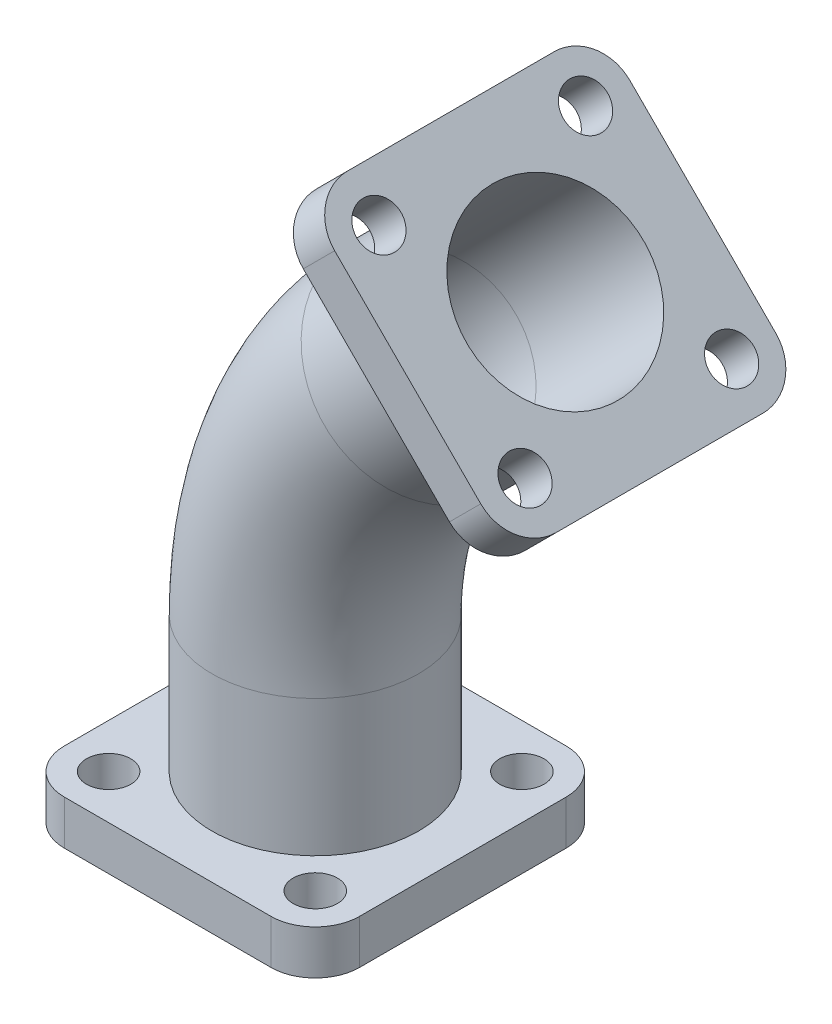
ISO-10303-21;
HEADER;
FILE_DESCRIPTION(('STEP AP214'),'2;1');
FILE_NAME('part.step','',(''),(''),'','','');
FILE_SCHEMA(('AUTOMOTIVE_DESIGN { 1 0 10303 214 1 1 1 1 }'));
ENDSEC;
DATA;
#1=APPLICATION_CONTEXT('core data for automotive mechanical design processes');
#2=APPLICATION_PROTOCOL_DEFINITION('international standard','automotive_design',2000,#1);
#3=PRODUCT_CONTEXT('',#1,'mechanical');
#4=PRODUCT('Part','Part','',(#3));
#5=PRODUCT_RELATED_PRODUCT_CATEGORY('part','',(#4));
#6=PRODUCT_DEFINITION_FORMATION('','',#4);
#7=PRODUCT_DEFINITION_CONTEXT('part definition',#1,'design');
#8=PRODUCT_DEFINITION('design','',#6,#7);
#9=PRODUCT_DEFINITION_SHAPE('','',#8);
#10=(LENGTH_UNIT() NAMED_UNIT(*) SI_UNIT(.MILLI.,.METRE.));
#11=(NAMED_UNIT(*) PLANE_ANGLE_UNIT() SI_UNIT($,.RADIAN.));
#12=(NAMED_UNIT(*) SI_UNIT($,.STERADIAN.) SOLID_ANGLE_UNIT());
#13=UNCERTAINTY_MEASURE_WITH_UNIT(LENGTH_MEASURE(1.E-05),#10,'distance_accuracy_value','');
#14=(GEOMETRIC_REPRESENTATION_CONTEXT(3) GLOBAL_UNCERTAINTY_ASSIGNED_CONTEXT((#13)) GLOBAL_UNIT_ASSIGNED_CONTEXT((#10,
#11,#12)) REPRESENTATION_CONTEXT('',''));
#15=CARTESIAN_POINT('',(0.,0.,0.));
#16=DIRECTION('',(0.,0.,1.));
#17=DIRECTION('',(1.,0.,0.));
#18=AXIS2_PLACEMENT_3D('',#15,#16,#17);
#19=CARTESIAN_POINT('',(138.817279836453,138.817279836453,0.));
#20=DIRECTION('',(-0.707106781186548,-0.707106781186547,0.));
#21=DIRECTION('',(0.707106781186547,-0.707106781186548,0.));
#22=AXIS2_PLACEMENT_3D('',#19,#20,#21);
#23=PLANE('',#22);
#24=CARTESIAN_POINT('',(106.066017177982,171.568542494924,35.));
#25=DIRECTION('',(0.707106781186548,0.707106781186547,0.));
#26=DIRECTION('',(-0.707106781186547,0.707106781186548,0.));
#27=AXIS2_PLACEMENT_3D('',#24,#25,#26);
#28=CIRCLE('',#27,7.50000000000001);
#29=CARTESIAN_POINT('',(100.762716319083,176.871843353823,35.));
#30=VERTEX_POINT('',#29);
#31=EDGE_CURVE('E766',#30,#30,#28,.T.);
#32=ORIENTED_EDGE('',*,*,#31,.F.);
#33=EDGE_LOOP('',(#32));
#34=FACE_BOUND('',#33,.T.);
#35=CARTESIAN_POINT('',(106.066017177982,171.568542494924,-35.));
#36=DIRECTION('',(0.707106781186548,0.707106781186547,0.));
#37=DIRECTION('',(-0.707106781186547,0.707106781186548,0.));
#38=AXIS2_PLACEMENT_3D('',#35,#36,#37);
#39=CIRCLE('',#38,7.50000000000001);
#40=CARTESIAN_POINT('',(100.762716319083,176.871843353823,-35.));
#41=VERTEX_POINT('',#40);
#42=EDGE_CURVE('E775',#41,#41,#39,.T.);
#43=ORIENTED_EDGE('',*,*,#42,.F.);
#44=EDGE_LOOP('',(#43));
#45=FACE_BOUND('',#44,.T.);
#46=CARTESIAN_POINT('',(81.3172798364531,196.317279836453,0.));
#47=DIRECTION('',(0.707106781186548,0.707106781186547,0.));
#48=DIRECTION('',(-0.707106781186547,0.707106781186548,0.));
#49=AXIS2_PLACEMENT_3D('',#46,#47,#48);
#50=CIRCLE('',#49,30.);
#51=CARTESIAN_POINT('',(60.1040764008567,217.530483272049,0.));
#52=VERTEX_POINT('',#51);
#53=EDGE_CURVE('E787',#52,#52,#50,.T.);
#54=ORIENTED_EDGE('',*,*,#53,.F.);
#55=EDGE_LOOP('',(#54));
#56=FACE_BOUND('',#55,.T.);
#57=DIRECTION('',(0.,0.,1.));
#58=VECTOR('',#57,1.);
#59=CARTESIAN_POINT('',(45.9619407771257,231.67261889578,50.));
#60=LINE('',#59,#58);
#61=CARTESIAN_POINT('',(45.9619407771257,231.67261889578,-35.));
#62=VERTEX_POINT('',#61);
#63=CARTESIAN_POINT('',(45.9619407771257,231.67261889578,35.));
#64=VERTEX_POINT('',#63);
#65=EDGE_CURVE('E287',#62,#64,#60,.T.);
#66=ORIENTED_EDGE('',*,*,#65,.T.);
#67=CARTESIAN_POINT('',(56.5685424949239,221.066017177982,35.));
#68=DIRECTION('',(-0.707106781186548,-0.707106781186547,0.));
#69=DIRECTION('',(0.707106781186547,-0.707106781186548,0.));
#70=AXIS2_PLACEMENT_3D('',#67,#68,#69);
#71=CIRCLE('',#70,15.);
#72=CARTESIAN_POINT('',(56.5685424949239,221.066017177982,50.));
#73=VERTEX_POINT('',#72);
#74=EDGE_CURVE('E254',#64,#73,#71,.F.);
#75=ORIENTED_EDGE('',*,*,#74,.T.);
#76=DIRECTION('',(0.707106781186547,-0.707106781186548,0.));
#77=VECTOR('',#76,1.);
#78=CARTESIAN_POINT('',(116.67261889578,160.961940777126,50.));
#79=LINE('',#78,#77);
#80=CARTESIAN_POINT('',(106.066017177982,171.568542494924,50.));
#81=VERTEX_POINT('',#80);
#82=EDGE_CURVE('E277',#73,#81,#79,.T.);
#83=ORIENTED_EDGE('',*,*,#82,.T.);
#84=CARTESIAN_POINT('',(106.066017177982,171.568542494924,35.));
#85=DIRECTION('',(-0.707106781186548,-0.707106781186547,0.));
#86=DIRECTION('',(0.707106781186547,-0.707106781186548,0.));
#87=AXIS2_PLACEMENT_3D('',#84,#85,#86);
#88=CIRCLE('',#87,15.);
#89=CARTESIAN_POINT('',(116.67261889578,160.961940777126,35.));
#90=VERTEX_POINT('',#89);
#91=EDGE_CURVE('E252',#81,#90,#88,.F.);
#92=ORIENTED_EDGE('',*,*,#91,.T.);
#93=DIRECTION('',(0.,0.,-1.));
#94=VECTOR('',#93,1.);
#95=CARTESIAN_POINT('',(116.67261889578,160.961940777126,50.));
#96=LINE('',#95,#94);
#97=CARTESIAN_POINT('',(116.67261889578,160.961940777126,-35.));
#98=VERTEX_POINT('',#97);
#99=EDGE_CURVE('E792',#90,#98,#96,.T.);
#100=ORIENTED_EDGE('',*,*,#99,.T.);
#101=CARTESIAN_POINT('',(106.066017177982,171.568542494924,-35.));
#102=DIRECTION('',(-0.707106781186548,-0.707106781186547,0.));
#103=DIRECTION('',(0.707106781186547,-0.707106781186548,0.));
#104=AXIS2_PLACEMENT_3D('',#101,#102,#103);
#105=CIRCLE('',#104,15.);
#106=CARTESIAN_POINT('',(106.066017177982,171.568542494924,-50.));
#107=VERTEX_POINT('',#106);
#108=EDGE_CURVE('E81',#98,#107,#105,.F.);
#109=ORIENTED_EDGE('',*,*,#108,.T.);
#110=DIRECTION('',(-0.707106781186547,0.707106781186548,0.));
#111=VECTOR('',#110,1.);
#112=CARTESIAN_POINT('',(116.67261889578,160.961940777126,-50.));
#113=LINE('',#112,#111);
#114=CARTESIAN_POINT('',(56.5685424949239,221.066017177982,-50.));
#115=VERTEX_POINT('',#114);
#116=EDGE_CURVE('E265',#107,#115,#113,.T.);
#117=ORIENTED_EDGE('',*,*,#116,.T.);
#118=CARTESIAN_POINT('',(56.5685424949239,221.066017177982,-35.));
#119=DIRECTION('',(-0.707106781186548,-0.707106781186547,0.));
#120=DIRECTION('',(0.707106781186547,-0.707106781186548,0.));
#121=AXIS2_PLACEMENT_3D('',#118,#119,#120);
#122=CIRCLE('',#121,15.);
#123=EDGE_CURVE('E250',#115,#62,#122,.F.);
#124=ORIENTED_EDGE('',*,*,#123,.T.);
#125=EDGE_LOOP('',(#66,#75,#83,#92,#100,#109,#117,#124));
#126=FACE_BOUND('',#125,.T.);
#127=CARTESIAN_POINT('',(56.5685424949239,221.066017177982,-35.));
#128=DIRECTION('',(0.707106781186548,0.707106781186547,0.));
#129=DIRECTION('',(-0.707106781186547,0.707106781186548,0.));
#130=AXIS2_PLACEMENT_3D('',#127,#128,#129);
#131=CIRCLE('',#130,7.50000000000001);
#132=CARTESIAN_POINT('',(51.2652416360248,226.369318036881,-35.));
#133=VERTEX_POINT('',#132);
#134=EDGE_CURVE('E781',#133,#133,#131,.T.);
#135=ORIENTED_EDGE('',*,*,#134,.F.);
#136=EDGE_LOOP('',(#135));
#137=FACE_BOUND('',#136,.T.);
#138=CARTESIAN_POINT('',(56.5685424949239,221.066017177982,35.));
#139=DIRECTION('',(0.707106781186548,0.707106781186547,0.));
#140=DIRECTION('',(-0.707106781186547,0.707106781186548,0.));
#141=AXIS2_PLACEMENT_3D('',#138,#139,#140);
#142=CIRCLE('',#141,7.50000000000001);
#143=CARTESIAN_POINT('',(51.2652416360248,226.369318036881,35.));
#144=VERTEX_POINT('',#143);
#145=EDGE_CURVE('E762',#144,#144,#142,.T.);
#146=ORIENTED_EDGE('',*,*,#145,.F.);
#147=EDGE_LOOP('',(#146));
#148=FACE_BOUND('',#147,.T.);
#149=ADVANCED_FACE('F61',(#34,#45,#56,#126,#137,#148),#23,.F.);
#150=CARTESIAN_POINT('',(-50.,0.,50.));
#151=DIRECTION('',(1.,0.,0.));
#152=DIRECTION('',(0.,0.,-1.));
#153=AXIS2_PLACEMENT_3D('',#150,#151,#152);
#154=PLANE('',#153);
#155=DIRECTION('',(0.,0.,-1.));
#156=VECTOR('',#155,1.);
#157=CARTESIAN_POINT('',(-50.,15.,50.));
#158=LINE('',#157,#156);
#159=CARTESIAN_POINT('',(-50.,15.,35.));
#160=VERTEX_POINT('',#159);
#161=CARTESIAN_POINT('',(-50.,15.,-35.));
#162=VERTEX_POINT('',#161);
#163=EDGE_CURVE('E332',#160,#162,#158,.T.);
#164=ORIENTED_EDGE('',*,*,#163,.T.);
#165=DIRECTION('',(0.,-1.,0.));
#166=VECTOR('',#165,1.);
#167=CARTESIAN_POINT('',(-50.,0.,-35.));
#168=LINE('',#167,#166);
#169=CARTESIAN_POINT('',(-50.,0.,-35.));
#170=VERTEX_POINT('',#169);
#171=EDGE_CURVE('E194',#162,#170,#168,.T.);
#172=ORIENTED_EDGE('',*,*,#171,.T.);
#173=DIRECTION('',(0.,0.,-1.));
#174=VECTOR('',#173,1.);
#175=CARTESIAN_POINT('',(-50.,0.,50.));
#176=LINE('',#175,#174);
#177=CARTESIAN_POINT('',(-50.,0.,35.));
#178=VERTEX_POINT('',#177);
#179=EDGE_CURVE('E177',#178,#170,#176,.T.);
#180=ORIENTED_EDGE('',*,*,#179,.F.);
#181=DIRECTION('',(0.,-1.,0.));
#182=VECTOR('',#181,1.);
#183=CARTESIAN_POINT('',(-50.,0.,35.));
#184=LINE('',#183,#182);
#185=EDGE_CURVE('E191',#178,#160,#184,.F.);
#186=ORIENTED_EDGE('',*,*,#185,.T.);
#187=EDGE_LOOP('',(#164,#172,#180,#186));
#188=FACE_BOUND('',#187,.T.);
#189=ADVANCED_FACE('F190',(#188),#154,.F.);
#190=CARTESIAN_POINT('',(-50.,0.,50.));
#191=DIRECTION('',(0.,1.,0.));
#192=DIRECTION('',(-1.,0.,0.));
#193=AXIS2_PLACEMENT_3D('',#190,#191,#192);
#194=PLANE('',#193);
#195=CARTESIAN_POINT('',(-35.,0.,-35.));
#196=DIRECTION('',(0.,1.,0.));
#197=DIRECTION('',(0.,0.,1.));
#198=AXIS2_PLACEMENT_3D('',#195,#196,#197);
#199=CIRCLE('',#198,7.50000000000001);
#200=CARTESIAN_POINT('',(-35.,0.,-27.5));
#201=VERTEX_POINT('',#200);
#202=EDGE_CURVE('E290',#201,#201,#199,.T.);
#203=ORIENTED_EDGE('',*,*,#202,.T.);
#204=EDGE_LOOP('',(#203));
#205=FACE_BOUND('',#204,.T.);
#206=CARTESIAN_POINT('',(-35.,0.,35.));
#207=DIRECTION('',(0.,1.,0.));
#208=DIRECTION('',(0.,0.,1.));
#209=AXIS2_PLACEMENT_3D('',#206,#207,#208);
#210=CIRCLE('',#209,7.50000000000001);
#211=CARTESIAN_POINT('',(-35.,0.,42.5));
#212=VERTEX_POINT('',#211);
#213=EDGE_CURVE('E296',#212,#212,#210,.T.);
#214=ORIENTED_EDGE('',*,*,#213,.T.);
#215=EDGE_LOOP('',(#214));
#216=FACE_BOUND('',#215,.T.);
#217=CARTESIAN_POINT('',(35.,0.,-35.));
#218=DIRECTION('',(0.,1.,0.));
#219=DIRECTION('',(0.,0.,1.));
#220=AXIS2_PLACEMENT_3D('',#217,#218,#219);
#221=CIRCLE('',#220,7.50000000000001);
#222=CARTESIAN_POINT('',(35.,0.,-27.5));
#223=VERTEX_POINT('',#222);
#224=EDGE_CURVE('E302',#223,#223,#221,.T.);
#225=ORIENTED_EDGE('',*,*,#224,.T.);
#226=EDGE_LOOP('',(#225));
#227=FACE_BOUND('',#226,.T.);
#228=CARTESIAN_POINT('',(35.,0.,35.));
#229=DIRECTION('',(0.,1.,0.));
#230=DIRECTION('',(0.,0.,1.));
#231=AXIS2_PLACEMENT_3D('',#228,#229,#230);
#232=CIRCLE('',#231,7.50000000000001);
#233=CARTESIAN_POINT('',(35.,0.,42.5));
#234=VERTEX_POINT('',#233);
#235=EDGE_CURVE('E308',#234,#234,#232,.T.);
#236=ORIENTED_EDGE('',*,*,#235,.T.);
#237=EDGE_LOOP('',(#236));
#238=FACE_BOUND('',#237,.T.);
#239=CARTESIAN_POINT('',(0.,0.,0.));
#240=DIRECTION('',(0.,1.,0.));
#241=DIRECTION('',(-1.,0.,0.));
#242=AXIS2_PLACEMENT_3D('',#239,#240,#241);
#243=CIRCLE('',#242,30.);
#244=CARTESIAN_POINT('',(-30.,0.,0.));
#245=VERTEX_POINT('',#244);
#246=EDGE_CURVE('E317',#245,#245,#243,.T.);
#247=ORIENTED_EDGE('',*,*,#246,.T.);
#248=EDGE_LOOP('',(#247));
#249=FACE_BOUND('',#248,.T.);
#250=ORIENTED_EDGE('',*,*,#179,.T.);
#251=CARTESIAN_POINT('',(-35.,0.,-35.));
#252=DIRECTION('',(0.,1.,0.));
#253=DIRECTION('',(-1.,0.,0.));
#254=AXIS2_PLACEMENT_3D('',#251,#252,#253);
#255=CIRCLE('',#254,15.);
#256=CARTESIAN_POINT('',(-35.,0.,-50.));
#257=VERTEX_POINT('',#256);
#258=EDGE_CURVE('E208',#170,#257,#255,.F.);
#259=ORIENTED_EDGE('',*,*,#258,.T.);
#260=DIRECTION('',(1.,0.,0.));
#261=VECTOR('',#260,1.);
#262=CARTESIAN_POINT('',(-50.,0.,-50.));
#263=LINE('',#262,#261);
#264=CARTESIAN_POINT('',(35.,0.,-50.));
#265=VERTEX_POINT('',#264);
#266=EDGE_CURVE('E326',#257,#265,#263,.T.);
#267=ORIENTED_EDGE('',*,*,#266,.T.);
#268=CARTESIAN_POINT('',(35.,0.,-35.));
#269=DIRECTION('',(0.,1.,0.));
#270=DIRECTION('',(-1.,0.,0.));
#271=AXIS2_PLACEMENT_3D('',#268,#269,#270);
#272=CIRCLE('',#271,15.);
#273=CARTESIAN_POINT('',(50.,0.,-35.));
#274=VERTEX_POINT('',#273);
#275=EDGE_CURVE('E184',#265,#274,#272,.F.);
#276=ORIENTED_EDGE('',*,*,#275,.T.);
#277=DIRECTION('',(0.,0.,-1.));
#278=VECTOR('',#277,1.);
#279=CARTESIAN_POINT('',(50.,0.,50.));
#280=LINE('',#279,#278);
#281=CARTESIAN_POINT('',(50.,0.,35.));
#282=VERTEX_POINT('',#281);
#283=EDGE_CURVE('E196',#282,#274,#280,.T.);
#284=ORIENTED_EDGE('',*,*,#283,.F.);
#285=CARTESIAN_POINT('',(35.,0.,35.));
#286=DIRECTION('',(0.,1.,0.));
#287=DIRECTION('',(-1.,0.,0.));
#288=AXIS2_PLACEMENT_3D('',#285,#286,#287);
#289=CIRCLE('',#288,15.);
#290=CARTESIAN_POINT('',(35.,0.,50.));
#291=VERTEX_POINT('',#290);
#292=EDGE_CURVE('E185',#282,#291,#289,.F.);
#293=ORIENTED_EDGE('',*,*,#292,.T.);
#294=DIRECTION('',(1.,0.,0.));
#295=VECTOR('',#294,1.);
#296=CARTESIAN_POINT('',(-50.,0.,50.));
#297=LINE('',#296,#295);
#298=CARTESIAN_POINT('',(-35.,0.,50.));
#299=VERTEX_POINT('',#298);
#300=EDGE_CURVE('E179',#299,#291,#297,.T.);
#301=ORIENTED_EDGE('',*,*,#300,.F.);
#302=CARTESIAN_POINT('',(-35.,0.,35.));
#303=DIRECTION('',(0.,1.,0.));
#304=DIRECTION('',(-1.,0.,0.));
#305=AXIS2_PLACEMENT_3D('',#302,#303,#304);
#306=CIRCLE('',#305,15.);
#307=EDGE_CURVE('E174',#299,#178,#306,.F.);
#308=ORIENTED_EDGE('',*,*,#307,.T.);
#309=EDGE_LOOP('',(#250,#259,#267,#276,#284,#293,#301,#308));
#310=FACE_BOUND('',#309,.T.);
#311=ADVANCED_FACE('F176',(#205,#216,#227,#238,#249,#310),#194,.F.);
#312=CARTESIAN_POINT('',(50.,0.,50.));
#313=DIRECTION('',(-1.,0.,0.));
#314=DIRECTION('',(0.,0.,1.));
#315=AXIS2_PLACEMENT_3D('',#312,#313,#314);
#316=PLANE('',#315);
#317=ORIENTED_EDGE('',*,*,#283,.T.);
#318=DIRECTION('',(0.,1.,0.));
#319=VECTOR('',#318,1.);
#320=CARTESIAN_POINT('',(50.,15.,-35.));
#321=LINE('',#320,#319);
#322=CARTESIAN_POINT('',(50.,15.,-35.));
#323=VERTEX_POINT('',#322);
#324=EDGE_CURVE('E223',#274,#323,#321,.T.);
#325=ORIENTED_EDGE('',*,*,#324,.T.);
#326=DIRECTION('',(0.,0.,-1.));
#327=VECTOR('',#326,1.);
#328=CARTESIAN_POINT('',(50.,15.,50.));
#329=LINE('',#328,#327);
#330=CARTESIAN_POINT('',(50.,15.,35.));
#331=VERTEX_POINT('',#330);
#332=EDGE_CURVE('E338',#331,#323,#329,.T.);
#333=ORIENTED_EDGE('',*,*,#332,.F.);
#334=DIRECTION('',(0.,1.,0.));
#335=VECTOR('',#334,1.);
#336=CARTESIAN_POINT('',(50.,0.,35.));
#337=LINE('',#336,#335);
#338=EDGE_CURVE('E221',#331,#282,#337,.F.);
#339=ORIENTED_EDGE('',*,*,#338,.T.);
#340=EDGE_LOOP('',(#317,#325,#333,#339));
#341=FACE_BOUND('',#340,.T.);
#342=ADVANCED_FACE('F345',(#341),#316,.F.);
#343=CARTESIAN_POINT('',(-50.,15.,50.));
#344=DIRECTION('',(0.,-1.,0.));
#345=DIRECTION('',(1.,0.,0.));
#346=AXIS2_PLACEMENT_3D('',#343,#344,#345);
#347=PLANE('',#346);
#348=CARTESIAN_POINT('',(-35.,15.,-35.));
#349=DIRECTION('',(0.,1.,0.));
#350=DIRECTION('',(0.,0.,1.));
#351=AXIS2_PLACEMENT_3D('',#348,#349,#350);
#352=CIRCLE('',#351,7.50000000000001);
#353=CARTESIAN_POINT('',(-35.,15.,-27.5));
#354=VERTEX_POINT('',#353);
#355=EDGE_CURVE('E286',#354,#354,#352,.T.);
#356=ORIENTED_EDGE('',*,*,#355,.F.);
#357=EDGE_LOOP('',(#356));
#358=FACE_BOUND('',#357,.T.);
#359=CARTESIAN_POINT('',(-35.,15.,35.));
#360=DIRECTION('',(0.,1.,0.));
#361=DIRECTION('',(0.,0.,1.));
#362=AXIS2_PLACEMENT_3D('',#359,#360,#361);
#363=CIRCLE('',#362,7.50000000000001);
#364=CARTESIAN_POINT('',(-35.,15.,42.5));
#365=VERTEX_POINT('',#364);
#366=EDGE_CURVE('E293',#365,#365,#363,.T.);
#367=ORIENTED_EDGE('',*,*,#366,.F.);
#368=EDGE_LOOP('',(#367));
#369=FACE_BOUND('',#368,.T.);
#370=CARTESIAN_POINT('',(35.,15.,-35.));
#371=DIRECTION('',(0.,1.,0.));
#372=DIRECTION('',(0.,0.,1.));
#373=AXIS2_PLACEMENT_3D('',#370,#371,#372);
#374=CIRCLE('',#373,7.50000000000001);
#375=CARTESIAN_POINT('',(35.,15.,-27.5));
#376=VERTEX_POINT('',#375);
#377=EDGE_CURVE('E299',#376,#376,#374,.T.);
#378=ORIENTED_EDGE('',*,*,#377,.F.);
#379=EDGE_LOOP('',(#378));
#380=FACE_BOUND('',#379,.T.);
#381=CARTESIAN_POINT('',(35.,15.,35.));
#382=DIRECTION('',(0.,1.,0.));
#383=DIRECTION('',(0.,0.,1.));
#384=AXIS2_PLACEMENT_3D('',#381,#382,#383);
#385=CIRCLE('',#384,7.50000000000001);
#386=CARTESIAN_POINT('',(35.,15.,42.5));
#387=VERTEX_POINT('',#386);
#388=EDGE_CURVE('E305',#387,#387,#385,.T.);
#389=ORIENTED_EDGE('',*,*,#388,.F.);
#390=EDGE_LOOP('',(#389));
#391=FACE_BOUND('',#390,.T.);
#392=CARTESIAN_POINT('',(0.,15.,0.));
#393=DIRECTION('',(0.,-1.,0.));
#394=DIRECTION('',(1.,0.,0.));
#395=AXIS2_PLACEMENT_3D('',#392,#393,#394);
#396=CIRCLE('',#395,35.);
#397=CARTESIAN_POINT('',(35.,15.,0.));
#398=VERTEX_POINT('',#397);
#399=EDGE_CURVE('E195',#398,#398,#396,.F.);
#400=ORIENTED_EDGE('',*,*,#399,.F.);
#401=EDGE_LOOP('',(#400));
#402=FACE_BOUND('',#401,.T.);
#403=DIRECTION('',(-1.,0.,0.));
#404=VECTOR('',#403,1.);
#405=CARTESIAN_POINT('',(-50.,15.,-50.));
#406=LINE('',#405,#404);
#407=CARTESIAN_POINT('',(35.,15.,-50.));
#408=VERTEX_POINT('',#407);
#409=CARTESIAN_POINT('',(-35.,15.,-50.));
#410=VERTEX_POINT('',#409);
#411=EDGE_CURVE('E329',#408,#410,#406,.T.);
#412=ORIENTED_EDGE('',*,*,#411,.T.);
#413=CARTESIAN_POINT('',(-35.,15.,-35.));
#414=DIRECTION('',(0.,-1.,0.));
#415=DIRECTION('',(1.,0.,0.));
#416=AXIS2_PLACEMENT_3D('',#413,#414,#415);
#417=CIRCLE('',#416,15.);
#418=EDGE_CURVE('E219',#410,#162,#417,.F.);
#419=ORIENTED_EDGE('',*,*,#418,.T.);
#420=ORIENTED_EDGE('',*,*,#163,.F.);
#421=CARTESIAN_POINT('',(-35.,15.,35.));
#422=DIRECTION('',(0.,-1.,0.));
#423=DIRECTION('',(1.,0.,0.));
#424=AXIS2_PLACEMENT_3D('',#421,#422,#423);
#425=CIRCLE('',#424,15.);
#426=CARTESIAN_POINT('',(-35.,15.,50.));
#427=VERTEX_POINT('',#426);
#428=EDGE_CURVE('E200',#160,#427,#425,.F.);
#429=ORIENTED_EDGE('',*,*,#428,.T.);
#430=DIRECTION('',(-1.,0.,0.));
#431=VECTOR('',#430,1.);
#432=CARTESIAN_POINT('',(-50.,15.,50.));
#433=LINE('',#432,#431);
#434=CARTESIAN_POINT('',(35.,15.,50.));
#435=VERTEX_POINT('',#434);
#436=EDGE_CURVE('E328',#435,#427,#433,.T.);
#437=ORIENTED_EDGE('',*,*,#436,.F.);
#438=CARTESIAN_POINT('',(35.,15.,35.));
#439=DIRECTION('',(0.,-1.,0.));
#440=DIRECTION('',(1.,0.,0.));
#441=AXIS2_PLACEMENT_3D('',#438,#439,#440);
#442=CIRCLE('',#441,15.);
#443=EDGE_CURVE('E214',#435,#331,#442,.F.);
#444=ORIENTED_EDGE('',*,*,#443,.T.);
#445=ORIENTED_EDGE('',*,*,#332,.T.);
#446=CARTESIAN_POINT('',(35.,15.,-35.));
#447=DIRECTION('',(0.,-1.,0.));
#448=DIRECTION('',(1.,0.,0.));
#449=AXIS2_PLACEMENT_3D('',#446,#447,#448);
#450=CIRCLE('',#449,15.);
#451=EDGE_CURVE('E217',#323,#408,#450,.F.);
#452=ORIENTED_EDGE('',*,*,#451,.T.);
#453=EDGE_LOOP('',(#412,#419,#420,#429,#437,#444,#445,#452));
#454=FACE_BOUND('',#453,.T.);
#455=ADVANCED_FACE('F355',(#358,#369,#380,#391,#402,#454),#347,.F.);
#456=CARTESIAN_POINT('',(0.,0.,50.));
#457=DIRECTION('',(0.,0.,-1.));
#458=DIRECTION('',(-1.,0.,0.));
#459=AXIS2_PLACEMENT_3D('',#456,#457,#458);
#460=PLANE('',#459);
#461=ORIENTED_EDGE('',*,*,#436,.T.);
#462=DIRECTION('',(0.,-1.,0.));
#463=VECTOR('',#462,1.);
#464=CARTESIAN_POINT('',(-35.,0.,50.));
#465=LINE('',#464,#463);
#466=EDGE_CURVE('E229',#427,#299,#465,.T.);
#467=ORIENTED_EDGE('',*,*,#466,.T.);
#468=ORIENTED_EDGE('',*,*,#300,.T.);
#469=DIRECTION('',(0.,1.,0.));
#470=VECTOR('',#469,1.);
#471=CARTESIAN_POINT('',(35.,0.,50.));
#472=LINE('',#471,#470);
#473=EDGE_CURVE('E226',#291,#435,#472,.T.);
#474=ORIENTED_EDGE('',*,*,#473,.T.);
#475=EDGE_LOOP('',(#461,#467,#468,#474));
#476=FACE_BOUND('',#475,.T.);
#477=ADVANCED_FACE('F365',(#476),#460,.F.);
#478=CARTESIAN_POINT('',(0.,0.,-50.));
#479=DIRECTION('',(0.,0.,-1.));
#480=DIRECTION('',(-1.,0.,0.));
#481=AXIS2_PLACEMENT_3D('',#478,#479,#480);
#482=PLANE('',#481);
#483=ORIENTED_EDGE('',*,*,#266,.F.);
#484=DIRECTION('',(0.,-1.,0.));
#485=VECTOR('',#484,1.);
#486=CARTESIAN_POINT('',(-35.,15.,-50.));
#487=LINE('',#486,#485);
#488=EDGE_CURVE('E212',#257,#410,#487,.F.);
#489=ORIENTED_EDGE('',*,*,#488,.T.);
#490=ORIENTED_EDGE('',*,*,#411,.F.);
#491=DIRECTION('',(0.,1.,0.));
#492=VECTOR('',#491,1.);
#493=CARTESIAN_POINT('',(35.,0.,-50.));
#494=LINE('',#493,#492);
#495=EDGE_CURVE('E210',#408,#265,#494,.F.);
#496=ORIENTED_EDGE('',*,*,#495,.T.);
#497=EDGE_LOOP('',(#483,#489,#490,#496));
#498=FACE_BOUND('',#497,.T.);
#499=ADVANCED_FACE('F359',(#498),#482,.T.);
#500=CARTESIAN_POINT('',(0.,0.,0.));
#501=DIRECTION('',(0.,1.,0.));
#502=DIRECTION('',(-1.,0.,0.));
#503=AXIS2_PLACEMENT_3D('',#500,#501,#502);
#504=CYLINDRICAL_SURFACE('',#503,35.);
#505=CARTESIAN_POINT('',(0.,61.1522368914975,0.));
#506=DIRECTION('',(0.,-1.,0.));
#507=DIRECTION('',(1.,0.,0.));
#508=AXIS2_PLACEMENT_3D('',#505,#506,#507);
#509=CIRCLE('',#508,35.);
#510=CARTESIAN_POINT('',(-35.,61.1522368914975,0.));
#511=VERTEX_POINT('',#510);
#512=EDGE_CURVE('E320',#511,#511,#509,.T.);
#513=ORIENTED_EDGE('',*,*,#512,.T.);
#514=EDGE_LOOP('',(#513));
#515=FACE_BOUND('',#514,.T.);
#516=ORIENTED_EDGE('',*,*,#399,.T.);
#517=EDGE_LOOP('',(#516));
#518=FACE_BOUND('',#517,.T.);
#519=ADVANCED_FACE('F437',(#515,#518),#504,.T.);
#520=CARTESIAN_POINT('',(130.,61.1522368914975,0.));
#521=DIRECTION('',(0.,0.,-1.));
#522=DIRECTION('',(-1.,0.,0.));
#523=AXIS2_PLACEMENT_3D('',#520,#521,#522);
#524=TOROIDAL_SURFACE('',#523,130.,35.);
#525=CARTESIAN_POINT('',(38.076118445749,153.076118445749,0.));
#526=DIRECTION('',(-0.707106781186548,-0.707106781186547,0.));
#527=DIRECTION('',(0.707106781186547,-0.707106781186548,0.));
#528=AXIS2_PLACEMENT_3D('',#525,#526,#527);
#529=CIRCLE('',#528,35.);
#530=CARTESIAN_POINT('',(13.3273811042199,177.824855787278,0.));
#531=VERTEX_POINT('',#530);
#532=EDGE_CURVE('E323',#531,#531,#529,.T.);
#533=CARTESIAN_POINT('',(130.,61.1522368914975,0.));
#534=DIRECTION('',(0.,0.,-1.));
#535=DIRECTION('',(-1.,0.,0.));
#536=AXIS2_PLACEMENT_3D('',#533,#534,#535);
#537=CIRCLE('',#536,165.);
#538=EDGE_CURVE('',#511,#531,#537,.T.);
#539=ORIENTED_EDGE('',*,*,#512,.F.);
#540=ORIENTED_EDGE('',*,*,#532,.T.);
#541=ORIENTED_EDGE('',*,*,#538,.T.);
#542=ORIENTED_EDGE('',*,*,#538,.F.);
#543=EDGE_LOOP('',(#539,#541,#540,#542));
#544=FACE_BOUND('',#543,.T.);
#545=ADVANCED_FACE('F436',(#544),#524,.T.);
#546=CARTESIAN_POINT('',(38.076118445749,153.076118445749,0.));
#547=DIRECTION('',(0.707106781186549,0.707106781186546,0.));
#548=DIRECTION('',(-0.707106781186546,0.707106781186549,0.));
#549=AXIS2_PLACEMENT_3D('',#546,#547,#548);
#550=CYLINDRICAL_SURFACE('',#549,35.);
#551=CARTESIAN_POINT('',(70.7106781186549,185.710678118655,0.));
#552=DIRECTION('',(-0.707106781186548,-0.707106781186547,0.));
#553=DIRECTION('',(0.707106781186547,-0.707106781186548,0.));
#554=AXIS2_PLACEMENT_3D('',#551,#552,#553);
#555=CIRCLE('',#554,35.);
#556=CARTESIAN_POINT('',(95.4594154601841,160.961940777126,0.));
#557=VERTEX_POINT('',#556);
#558=EDGE_CURVE('E283',#557,#557,#555,.T.);
#559=ORIENTED_EDGE('',*,*,#558,.T.);
#560=EDGE_LOOP('',(#559));
#561=FACE_BOUND('',#560,.T.);
#562=ORIENTED_EDGE('',*,*,#532,.F.);
#563=EDGE_LOOP('',(#562));
#564=FACE_BOUND('',#563,.T.);
#565=ADVANCED_FACE('F427',(#561,#564),#550,.T.);
#566=CARTESIAN_POINT('',(0.,-4.99999999999992,0.));
#567=DIRECTION('',(0.,1.,0.));
#568=DIRECTION('',(-1.,0.,0.));
#569=AXIS2_PLACEMENT_3D('',#566,#567,#568);
#570=CYLINDRICAL_SURFACE('',#569,30.);
#571=ORIENTED_EDGE('',*,*,#246,.F.);
#572=EDGE_LOOP('',(#571));
#573=FACE_BOUND('',#572,.T.);
#574=CARTESIAN_POINT('',(0.,61.1522368914975,0.));
#575=DIRECTION('',(0.,-1.,0.));
#576=DIRECTION('',(1.,0.,0.));
#577=AXIS2_PLACEMENT_3D('',#574,#575,#576);
#578=CIRCLE('',#577,30.);
#579=CARTESIAN_POINT('',(-30.,61.1522368914975,0.));
#580=VERTEX_POINT('',#579);
#581=EDGE_CURVE('E311',#580,#580,#578,.T.);
#582=ORIENTED_EDGE('',*,*,#581,.F.);
#583=EDGE_LOOP('',(#582));
#584=FACE_BOUND('',#583,.T.);
#585=ADVANCED_FACE('F423',(#573,#584),#570,.F.);
#586=CARTESIAN_POINT('',(130.,61.1522368914975,0.));
#587=DIRECTION('',(0.,0.,-1.));
#588=DIRECTION('',(-1.,0.,0.));
#589=AXIS2_PLACEMENT_3D('',#586,#587,#588);
#590=TOROIDAL_SURFACE('',#589,130.,30.);
#591=CARTESIAN_POINT('',(38.076118445749,153.076118445749,0.));
#592=DIRECTION('',(-0.707106781186548,-0.707106781186547,0.));
#593=DIRECTION('',(0.707106781186547,-0.707106781186548,0.));
#594=AXIS2_PLACEMENT_3D('',#591,#592,#593);
#595=CIRCLE('',#594,30.);
#596=CARTESIAN_POINT('',(16.8629150101526,174.289321881345,0.));
#597=VERTEX_POINT('',#596);
#598=EDGE_CURVE('E314',#597,#597,#595,.T.);
#599=CARTESIAN_POINT('',(130.,61.1522368914975,0.));
#600=DIRECTION('',(0.,0.,-1.));
#601=DIRECTION('',(-1.,0.,0.));
#602=AXIS2_PLACEMENT_3D('',#599,#600,#601);
#603=CIRCLE('',#602,160.);
#604=EDGE_CURVE('',#580,#597,#603,.T.);
#605=ORIENTED_EDGE('',*,*,#581,.T.);
#606=ORIENTED_EDGE('',*,*,#598,.F.);
#607=ORIENTED_EDGE('',*,*,#604,.T.);
#608=ORIENTED_EDGE('',*,*,#604,.F.);
#609=EDGE_LOOP('',(#605,#607,#606,#608));
#610=FACE_BOUND('',#609,.T.);
#611=ADVANCED_FACE('F426',(#610),#590,.F.);
#612=CARTESIAN_POINT('',(38.0761184457492,153.076118445749,0.));
#613=DIRECTION('',(0.707106781186549,0.707106781186547,0.));
#614=DIRECTION('',(-0.707106781186547,0.707106781186549,0.));
#615=AXIS2_PLACEMENT_3D('',#612,#613,#614);
#616=CYLINDRICAL_SURFACE('',#615,30.);
#617=ORIENTED_EDGE('',*,*,#598,.T.);
#618=EDGE_LOOP('',(#617));
#619=FACE_BOUND('',#618,.T.);
#620=ORIENTED_EDGE('',*,*,#53,.T.);
#621=EDGE_LOOP('',(#620));
#622=FACE_BOUND('',#621,.T.);
#623=ADVANCED_FACE('F431',(#619,#622),#616,.F.);
#624=CARTESIAN_POINT('',(-35.,0.,-35.));
#625=DIRECTION('',(0.,1.,0.));
#626=DIRECTION('',(0.,0.,1.));
#627=AXIS2_PLACEMENT_3D('',#624,#625,#626);
#628=CYLINDRICAL_SURFACE('',#627,15.);
#629=ORIENTED_EDGE('',*,*,#418,.F.);
#630=ORIENTED_EDGE('',*,*,#488,.F.);
#631=ORIENTED_EDGE('',*,*,#258,.F.);
#632=ORIENTED_EDGE('',*,*,#171,.F.);
#633=EDGE_LOOP('',(#629,#630,#631,#632));
#634=FACE_BOUND('',#633,.T.);
#635=ADVANCED_FACE('F362',(#634),#628,.T.);
#636=CARTESIAN_POINT('',(35.,0.,-35.));
#637=DIRECTION('',(0.,-1.,0.));
#638=DIRECTION('',(0.,0.,-1.));
#639=AXIS2_PLACEMENT_3D('',#636,#637,#638);
#640=CYLINDRICAL_SURFACE('',#639,15.);
#641=ORIENTED_EDGE('',*,*,#275,.F.);
#642=ORIENTED_EDGE('',*,*,#495,.F.);
#643=ORIENTED_EDGE('',*,*,#451,.F.);
#644=ORIENTED_EDGE('',*,*,#324,.F.);
#645=EDGE_LOOP('',(#641,#642,#643,#644));
#646=FACE_BOUND('',#645,.T.);
#647=ADVANCED_FACE('F351',(#646),#640,.T.);
#648=CARTESIAN_POINT('',(-35.,0.,35.));
#649=DIRECTION('',(0.,-1.,0.));
#650=DIRECTION('',(0.,0.,-1.));
#651=AXIS2_PLACEMENT_3D('',#648,#649,#650);
#652=CYLINDRICAL_SURFACE('',#651,15.);
#653=ORIENTED_EDGE('',*,*,#428,.F.);
#654=ORIENTED_EDGE('',*,*,#185,.F.);
#655=ORIENTED_EDGE('',*,*,#307,.F.);
#656=ORIENTED_EDGE('',*,*,#466,.F.);
#657=EDGE_LOOP('',(#653,#654,#655,#656));
#658=FACE_BOUND('',#657,.T.);
#659=ADVANCED_FACE('F199',(#658),#652,.T.);
#660=CARTESIAN_POINT('',(35.,0.,35.));
#661=DIRECTION('',(0.,1.,0.));
#662=DIRECTION('',(0.,0.,1.));
#663=AXIS2_PLACEMENT_3D('',#660,#661,#662);
#664=CYLINDRICAL_SURFACE('',#663,15.);
#665=ORIENTED_EDGE('',*,*,#292,.F.);
#666=ORIENTED_EDGE('',*,*,#338,.F.);
#667=ORIENTED_EDGE('',*,*,#443,.F.);
#668=ORIENTED_EDGE('',*,*,#473,.F.);
#669=EDGE_LOOP('',(#665,#666,#667,#668));
#670=FACE_BOUND('',#669,.T.);
#671=ADVANCED_FACE('F368',(#670),#664,.T.);
#672=CARTESIAN_POINT('',(35.,15.,35.));
#673=DIRECTION('',(0.,1.,0.));
#674=DIRECTION('',(0.,0.,1.));
#675=AXIS2_PLACEMENT_3D('',#672,#673,#674);
#676=CYLINDRICAL_SURFACE('',#675,7.50000000000001);
#677=ORIENTED_EDGE('',*,*,#235,.F.);
#678=EDGE_LOOP('',(#677));
#679=FACE_BOUND('',#678,.T.);
#680=ORIENTED_EDGE('',*,*,#388,.T.);
#681=EDGE_LOOP('',(#680));
#682=FACE_BOUND('',#681,.T.);
#683=ADVANCED_FACE('F370',(#679,#682),#676,.F.);
#684=CARTESIAN_POINT('',(35.,15.,-35.));
#685=DIRECTION('',(0.,1.,0.));
#686=DIRECTION('',(0.,0.,1.));
#687=AXIS2_PLACEMENT_3D('',#684,#685,#686);
#688=CYLINDRICAL_SURFACE('',#687,7.50000000000001);
#689=ORIENTED_EDGE('',*,*,#224,.F.);
#690=EDGE_LOOP('',(#689));
#691=FACE_BOUND('',#690,.T.);
#692=ORIENTED_EDGE('',*,*,#377,.T.);
#693=EDGE_LOOP('',(#692));
#694=FACE_BOUND('',#693,.T.);
#695=ADVANCED_FACE('F376',(#691,#694),#688,.F.);
#696=CARTESIAN_POINT('',(-35.,15.,35.));
#697=DIRECTION('',(0.,1.,0.));
#698=DIRECTION('',(0.,0.,1.));
#699=AXIS2_PLACEMENT_3D('',#696,#697,#698);
#700=CYLINDRICAL_SURFACE('',#699,7.50000000000001);
#701=ORIENTED_EDGE('',*,*,#213,.F.);
#702=EDGE_LOOP('',(#701));
#703=FACE_BOUND('',#702,.T.);
#704=ORIENTED_EDGE('',*,*,#366,.T.);
#705=EDGE_LOOP('',(#704));
#706=FACE_BOUND('',#705,.T.);
#707=ADVANCED_FACE('F415',(#703,#706),#700,.F.);
#708=CARTESIAN_POINT('',(-35.,15.,-35.));
#709=DIRECTION('',(0.,1.,0.));
#710=DIRECTION('',(0.,0.,1.));
#711=AXIS2_PLACEMENT_3D('',#708,#709,#710);
#712=CYLINDRICAL_SURFACE('',#711,7.50000000000001);
#713=ORIENTED_EDGE('',*,*,#202,.F.);
#714=EDGE_LOOP('',(#713));
#715=FACE_BOUND('',#714,.T.);
#716=ORIENTED_EDGE('',*,*,#355,.T.);
#717=EDGE_LOOP('',(#716));
#718=FACE_BOUND('',#717,.T.);
#719=ADVANCED_FACE('F411',(#715,#718),#712,.F.);
#720=CARTESIAN_POINT('',(116.67261889578,160.961940777126,50.));
#721=DIRECTION('',(0.,0.,-1.));
#722=DIRECTION('',(-1.,0.,0.));
#723=AXIS2_PLACEMENT_3D('',#720,#721,#722);
#724=PLANE('',#723);
#725=ORIENTED_EDGE('',*,*,#82,.F.);
#726=DIRECTION('',(-0.707106781186548,-0.707106781186547,0.));
#727=VECTOR('',#726,1.);
#728=CARTESIAN_POINT('',(56.5685424949239,221.066017177982,50.));
#729=LINE('',#728,#727);
#730=CARTESIAN_POINT('',(45.9619407771257,210.459415460184,50.));
#731=VERTEX_POINT('',#730);
#732=EDGE_CURVE('E233',#73,#731,#729,.T.);
#733=ORIENTED_EDGE('',*,*,#732,.T.);
#734=DIRECTION('',(0.707106781186547,-0.707106781186548,0.));
#735=VECTOR('',#734,1.);
#736=CARTESIAN_POINT('',(106.066017177982,150.355339059327,50.));
#737=LINE('',#736,#735);
#738=CARTESIAN_POINT('',(95.459415460184,160.961940777126,50.));
#739=VERTEX_POINT('',#738);
#740=EDGE_CURVE('E279',#731,#739,#737,.T.);
#741=ORIENTED_EDGE('',*,*,#740,.T.);
#742=DIRECTION('',(-0.707106781186548,-0.707106781186547,0.));
#743=VECTOR('',#742,1.);
#744=CARTESIAN_POINT('',(106.066017177982,171.568542494924,50.));
#745=LINE('',#744,#743);
#746=EDGE_CURVE('E231',#739,#81,#745,.F.);
#747=ORIENTED_EDGE('',*,*,#746,.T.);
#748=EDGE_LOOP('',(#725,#733,#741,#747));
#749=FACE_BOUND('',#748,.T.);
#750=ADVANCED_FACE('F407',(#749),#724,.F.);
#751=CARTESIAN_POINT('',(116.67261889578,160.961940777126,50.));
#752=DIRECTION('',(-0.707106781186547,0.707106781186548,0.));
#753=DIRECTION('',(-0.707106781186548,-0.707106781186547,0.));
#754=AXIS2_PLACEMENT_3D('',#751,#752,#753);
#755=PLANE('',#754);
#756=ORIENTED_EDGE('',*,*,#99,.F.);
#757=DIRECTION('',(-0.707106781186548,-0.707106781186547,0.));
#758=VECTOR('',#757,1.);
#759=CARTESIAN_POINT('',(116.67261889578,160.961940777126,35.));
#760=LINE('',#759,#758);
#761=CARTESIAN_POINT('',(106.066017177982,150.355339059327,35.));
#762=VERTEX_POINT('',#761);
#763=EDGE_CURVE('E258',#90,#762,#760,.T.);
#764=ORIENTED_EDGE('',*,*,#763,.T.);
#765=DIRECTION('',(0.,0.,-1.));
#766=VECTOR('',#765,1.);
#767=CARTESIAN_POINT('',(106.066017177982,150.355339059327,50.));
#768=LINE('',#767,#766);
#769=CARTESIAN_POINT('',(106.066017177982,150.355339059327,-35.));
#770=VERTEX_POINT('',#769);
#771=EDGE_CURVE('E274',#762,#770,#768,.T.);
#772=ORIENTED_EDGE('',*,*,#771,.T.);
#773=DIRECTION('',(-0.707106781186548,-0.707106781186547,0.));
#774=VECTOR('',#773,1.);
#775=CARTESIAN_POINT('',(116.67261889578,160.961940777126,-35.));
#776=LINE('',#775,#774);
#777=EDGE_CURVE('E256',#770,#98,#776,.F.);
#778=ORIENTED_EDGE('',*,*,#777,.T.);
#779=EDGE_LOOP('',(#756,#764,#772,#778));
#780=FACE_BOUND('',#779,.T.);
#781=ADVANCED_FACE('F404',(#780),#755,.F.);
#782=CARTESIAN_POINT('',(116.67261889578,160.961940777126,-50.));
#783=DIRECTION('',(0.,0.,1.));
#784=DIRECTION('',(1.,0.,0.));
#785=AXIS2_PLACEMENT_3D('',#782,#783,#784);
#786=PLANE('',#785);
#787=DIRECTION('',(-0.707106781186547,0.707106781186548,0.));
#788=VECTOR('',#787,1.);
#789=CARTESIAN_POINT('',(106.066017177982,150.355339059327,-50.));
#790=LINE('',#789,#788);
#791=CARTESIAN_POINT('',(95.459415460184,160.961940777126,-50.));
#792=VERTEX_POINT('',#791);
#793=CARTESIAN_POINT('',(45.9619407771257,210.459415460184,-50.));
#794=VERTEX_POINT('',#793);
#795=EDGE_CURVE('E264',#792,#794,#790,.T.);
#796=ORIENTED_EDGE('',*,*,#795,.T.);
#797=DIRECTION('',(-0.707106781186548,-0.707106781186547,0.));
#798=VECTOR('',#797,1.);
#799=CARTESIAN_POINT('',(56.5685424949239,221.066017177982,-50.));
#800=LINE('',#799,#798);
#801=EDGE_CURVE('E12',#794,#115,#800,.F.);
#802=ORIENTED_EDGE('',*,*,#801,.T.);
#803=ORIENTED_EDGE('',*,*,#116,.F.);
#804=DIRECTION('',(-0.707106781186548,-0.707106781186547,0.));
#805=VECTOR('',#804,1.);
#806=CARTESIAN_POINT('',(106.066017177982,171.568542494924,-50.));
#807=LINE('',#806,#805);
#808=EDGE_CURVE('E69',#107,#792,#807,.T.);
#809=ORIENTED_EDGE('',*,*,#808,.T.);
#810=EDGE_LOOP('',(#796,#802,#803,#809));
#811=FACE_BOUND('',#810,.T.);
#812=ADVANCED_FACE('F263',(#811),#786,.F.);
#813=CARTESIAN_POINT('',(45.9619407771257,231.67261889578,50.));
#814=DIRECTION('',(0.707106781186547,-0.707106781186548,0.));
#815=DIRECTION('',(0.707106781186548,0.707106781186547,0.));
#816=AXIS2_PLACEMENT_3D('',#813,#814,#815);
#817=PLANE('',#816);
#818=DIRECTION('',(0.,0.,1.));
#819=VECTOR('',#818,1.);
#820=CARTESIAN_POINT('',(35.3553390593275,221.066017177982,50.));
#821=LINE('',#820,#819);
#822=CARTESIAN_POINT('',(35.3553390593275,221.066017177982,-35.));
#823=VERTEX_POINT('',#822);
#824=CARTESIAN_POINT('',(35.3553390593275,221.066017177982,35.));
#825=VERTEX_POINT('',#824);
#826=EDGE_CURVE('E273',#823,#825,#821,.T.);
#827=ORIENTED_EDGE('',*,*,#826,.T.);
#828=DIRECTION('',(-0.707106781186548,-0.707106781186547,0.));
#829=VECTOR('',#828,1.);
#830=CARTESIAN_POINT('',(45.9619407771257,231.67261889578,35.));
#831=LINE('',#830,#829);
#832=EDGE_CURVE('E247',#825,#64,#831,.F.);
#833=ORIENTED_EDGE('',*,*,#832,.T.);
#834=ORIENTED_EDGE('',*,*,#65,.F.);
#835=DIRECTION('',(-0.707106781186548,-0.707106781186547,0.));
#836=VECTOR('',#835,1.);
#837=CARTESIAN_POINT('',(45.9619407771257,231.67261889578,-35.));
#838=LINE('',#837,#836);
#839=EDGE_CURVE('E244',#62,#823,#838,.T.);
#840=ORIENTED_EDGE('',*,*,#839,.T.);
#841=EDGE_LOOP('',(#827,#833,#834,#840));
#842=FACE_BOUND('',#841,.T.);
#843=ADVANCED_FACE('F397',(#842),#817,.F.);
#844=CARTESIAN_POINT('',(128.210678118655,128.210678118655,0.));
#845=DIRECTION('',(-0.707106781186548,-0.707106781186547,0.));
#846=DIRECTION('',(0.707106781186547,-0.707106781186548,0.));
#847=AXIS2_PLACEMENT_3D('',#844,#845,#846);
#848=PLANE('',#847);
#849=CARTESIAN_POINT('',(45.9619407771257,210.459415460184,35.));
#850=DIRECTION('',(-0.707106781186548,-0.707106781186547,0.));
#851=DIRECTION('',(0.707106781186547,-0.707106781186548,0.));
#852=AXIS2_PLACEMENT_3D('',#849,#850,#851);
#853=CIRCLE('',#852,7.50000000000001);
#854=CARTESIAN_POINT('',(51.2652416360248,205.156114601285,35.));
#855=VERTEX_POINT('',#854);
#856=EDGE_CURVE('E765',#855,#855,#853,.T.);
#857=ORIENTED_EDGE('',*,*,#856,.F.);
#858=EDGE_LOOP('',(#857));
#859=FACE_BOUND('',#858,.T.);
#860=CARTESIAN_POINT('',(95.459415460184,160.961940777126,35.));
#861=DIRECTION('',(-0.707106781186548,-0.707106781186547,0.));
#862=DIRECTION('',(0.707106781186547,-0.707106781186548,0.));
#863=AXIS2_PLACEMENT_3D('',#860,#861,#862);
#864=CIRCLE('',#863,7.50000000000001);
#865=CARTESIAN_POINT('',(100.762716319083,155.658639918226,35.));
#866=VERTEX_POINT('',#865);
#867=EDGE_CURVE('E769',#866,#866,#864,.T.);
#868=ORIENTED_EDGE('',*,*,#867,.F.);
#869=EDGE_LOOP('',(#868));
#870=FACE_BOUND('',#869,.T.);
#871=CARTESIAN_POINT('',(95.459415460184,160.961940777126,-35.));
#872=DIRECTION('',(-0.707106781186548,-0.707106781186547,0.));
#873=DIRECTION('',(0.707106781186547,-0.707106781186548,0.));
#874=AXIS2_PLACEMENT_3D('',#871,#872,#873);
#875=CIRCLE('',#874,7.50000000000001);
#876=CARTESIAN_POINT('',(100.762716319083,155.658639918226,-35.));
#877=VERTEX_POINT('',#876);
#878=EDGE_CURVE('E778',#877,#877,#875,.T.);
#879=ORIENTED_EDGE('',*,*,#878,.F.);
#880=EDGE_LOOP('',(#879));
#881=FACE_BOUND('',#880,.T.);
#882=CARTESIAN_POINT('',(45.9619407771257,210.459415460184,-35.));
#883=DIRECTION('',(-0.707106781186548,-0.707106781186547,0.));
#884=DIRECTION('',(0.707106781186547,-0.707106781186548,0.));
#885=AXIS2_PLACEMENT_3D('',#882,#883,#884);
#886=CIRCLE('',#885,7.50000000000001);
#887=CARTESIAN_POINT('',(51.2652416360248,205.156114601285,-35.));
#888=VERTEX_POINT('',#887);
#889=EDGE_CURVE('E784',#888,#888,#886,.T.);
#890=ORIENTED_EDGE('',*,*,#889,.F.);
#891=EDGE_LOOP('',(#890));
#892=FACE_BOUND('',#891,.T.);
#893=ORIENTED_EDGE('',*,*,#558,.F.);
#894=EDGE_LOOP('',(#893));
#895=FACE_BOUND('',#894,.T.);
#896=ORIENTED_EDGE('',*,*,#740,.F.);
#897=CARTESIAN_POINT('',(45.9619407771257,210.459415460184,35.));
#898=DIRECTION('',(-0.707106781186548,-0.707106781186547,0.));
#899=DIRECTION('',(0.707106781186547,-0.707106781186548,0.));
#900=AXIS2_PLACEMENT_3D('',#897,#898,#899);
#901=CIRCLE('',#900,15.);
#902=EDGE_CURVE('E242',#731,#825,#901,.T.);
#903=ORIENTED_EDGE('',*,*,#902,.T.);
#904=ORIENTED_EDGE('',*,*,#826,.F.);
#905=CARTESIAN_POINT('',(45.9619407771257,210.459415460184,-35.));
#906=DIRECTION('',(-0.707106781186548,-0.707106781186547,0.));
#907=DIRECTION('',(0.707106781186547,-0.707106781186548,0.));
#908=AXIS2_PLACEMENT_3D('',#905,#906,#907);
#909=CIRCLE('',#908,15.);
#910=EDGE_CURVE('E238',#823,#794,#909,.T.);
#911=ORIENTED_EDGE('',*,*,#910,.T.);
#912=ORIENTED_EDGE('',*,*,#795,.F.);
#913=CARTESIAN_POINT('',(95.459415460184,160.961940777126,-35.));
#914=DIRECTION('',(-0.707106781186548,-0.707106781186547,0.));
#915=DIRECTION('',(0.707106781186547,-0.707106781186548,0.));
#916=AXIS2_PLACEMENT_3D('',#913,#914,#915);
#917=CIRCLE('',#916,15.);
#918=EDGE_CURVE('E236',#792,#770,#917,.T.);
#919=ORIENTED_EDGE('',*,*,#918,.T.);
#920=ORIENTED_EDGE('',*,*,#771,.F.);
#921=CARTESIAN_POINT('',(95.459415460184,160.961940777126,35.));
#922=DIRECTION('',(-0.707106781186548,-0.707106781186547,0.));
#923=DIRECTION('',(0.707106781186547,-0.707106781186548,0.));
#924=AXIS2_PLACEMENT_3D('',#921,#922,#923);
#925=CIRCLE('',#924,15.);
#926=EDGE_CURVE('E240',#762,#739,#925,.T.);
#927=ORIENTED_EDGE('',*,*,#926,.T.);
#928=EDGE_LOOP('',(#896,#903,#904,#911,#912,#919,#920,#927));
#929=FACE_BOUND('',#928,.T.);
#930=ADVANCED_FACE('F269',(#859,#870,#881,#892,#895,#929),#848,.T.);
#931=CARTESIAN_POINT('',(56.5685424949239,221.066017177982,35.));
#932=DIRECTION('',(-0.707106781186548,-0.707106781186547,0.));
#933=DIRECTION('',(0.707106781186547,-0.707106781186548,0.));
#934=AXIS2_PLACEMENT_3D('',#931,#932,#933);
#935=CYLINDRICAL_SURFACE('',#934,15.);
#936=ORIENTED_EDGE('',*,*,#74,.F.);
#937=ORIENTED_EDGE('',*,*,#832,.F.);
#938=ORIENTED_EDGE('',*,*,#902,.F.);
#939=ORIENTED_EDGE('',*,*,#732,.F.);
#940=EDGE_LOOP('',(#936,#937,#938,#939));
#941=FACE_BOUND('',#940,.T.);
#942=ADVANCED_FACE('F396',(#941),#935,.T.);
#943=CARTESIAN_POINT('',(106.066017177982,171.568542494924,35.));
#944=DIRECTION('',(-0.707106781186548,-0.707106781186547,0.));
#945=DIRECTION('',(0.707106781186547,-0.707106781186548,0.));
#946=AXIS2_PLACEMENT_3D('',#943,#944,#945);
#947=CYLINDRICAL_SURFACE('',#946,15.);
#948=ORIENTED_EDGE('',*,*,#91,.F.);
#949=ORIENTED_EDGE('',*,*,#746,.F.);
#950=ORIENTED_EDGE('',*,*,#926,.F.);
#951=ORIENTED_EDGE('',*,*,#763,.F.);
#952=EDGE_LOOP('',(#948,#949,#950,#951));
#953=FACE_BOUND('',#952,.T.);
#954=ADVANCED_FACE('F560',(#953),#947,.T.);
#955=CARTESIAN_POINT('',(56.5685424949239,221.066017177982,-35.));
#956=DIRECTION('',(-0.707106781186548,-0.707106781186547,0.));
#957=DIRECTION('',(0.707106781186547,-0.707106781186548,0.));
#958=AXIS2_PLACEMENT_3D('',#955,#956,#957);
#959=CYLINDRICAL_SURFACE('',#958,15.);
#960=ORIENTED_EDGE('',*,*,#123,.F.);
#961=ORIENTED_EDGE('',*,*,#801,.F.);
#962=ORIENTED_EDGE('',*,*,#910,.F.);
#963=ORIENTED_EDGE('',*,*,#839,.F.);
#964=EDGE_LOOP('',(#960,#961,#962,#963));
#965=FACE_BOUND('',#964,.T.);
#966=ADVANCED_FACE('F570',(#965),#959,.T.);
#967=CARTESIAN_POINT('',(106.066017177982,171.568542494924,-35.));
#968=DIRECTION('',(-0.707106781186548,-0.707106781186547,0.));
#969=DIRECTION('',(0.707106781186547,-0.707106781186548,0.));
#970=AXIS2_PLACEMENT_3D('',#967,#968,#969);
#971=CYLINDRICAL_SURFACE('',#970,15.);
#972=ORIENTED_EDGE('',*,*,#108,.F.);
#973=ORIENTED_EDGE('',*,*,#777,.F.);
#974=ORIENTED_EDGE('',*,*,#918,.F.);
#975=ORIENTED_EDGE('',*,*,#808,.F.);
#976=EDGE_LOOP('',(#972,#973,#974,#975));
#977=FACE_BOUND('',#976,.T.);
#978=ADVANCED_FACE('F63',(#977),#971,.T.);
#979=CARTESIAN_POINT('',(56.5685424949239,221.066017177982,-35.));
#980=DIRECTION('',(0.707106781186548,0.707106781186547,0.));
#981=DIRECTION('',(-0.707106781186547,0.707106781186548,0.));
#982=AXIS2_PLACEMENT_3D('',#979,#980,#981);
#983=CYLINDRICAL_SURFACE('',#982,7.50000000000001);
#984=ORIENTED_EDGE('',*,*,#134,.T.);
#985=EDGE_LOOP('',(#984));
#986=FACE_BOUND('',#985,.T.);
#987=ORIENTED_EDGE('',*,*,#889,.T.);
#988=EDGE_LOOP('',(#987));
#989=FACE_BOUND('',#988,.T.);
#990=ADVANCED_FACE('F392',(#986,#989),#983,.F.);
#991=CARTESIAN_POINT('',(106.066017177982,171.568542494924,-35.));
#992=DIRECTION('',(0.707106781186548,0.707106781186547,0.));
#993=DIRECTION('',(-0.707106781186547,0.707106781186548,0.));
#994=AXIS2_PLACEMENT_3D('',#991,#992,#993);
#995=CYLINDRICAL_SURFACE('',#994,7.50000000000001);
#996=ORIENTED_EDGE('',*,*,#42,.T.);
#997=EDGE_LOOP('',(#996));
#998=FACE_BOUND('',#997,.T.);
#999=ORIENTED_EDGE('',*,*,#878,.T.);
#1000=EDGE_LOOP('',(#999));
#1001=FACE_BOUND('',#1000,.T.);
#1002=ADVANCED_FACE('F616',(#998,#1001),#995,.F.);
#1003=CARTESIAN_POINT('',(106.066017177982,171.568542494924,35.));
#1004=DIRECTION('',(0.707106781186548,0.707106781186547,0.));
#1005=DIRECTION('',(-0.707106781186547,0.707106781186548,0.));
#1006=AXIS2_PLACEMENT_3D('',#1003,#1004,#1005);
#1007=CYLINDRICAL_SURFACE('',#1006,7.50000000000001);
#1008=ORIENTED_EDGE('',*,*,#31,.T.);
#1009=EDGE_LOOP('',(#1008));
#1010=FACE_BOUND('',#1009,.T.);
#1011=ORIENTED_EDGE('',*,*,#867,.T.);
#1012=EDGE_LOOP('',(#1011));
#1013=FACE_BOUND('',#1012,.T.);
#1014=ADVANCED_FACE('F626',(#1010,#1013),#1007,.F.);
#1015=CARTESIAN_POINT('',(56.5685424949239,221.066017177982,35.));
#1016=DIRECTION('',(0.707106781186548,0.707106781186547,0.));
#1017=DIRECTION('',(-0.707106781186547,0.707106781186548,0.));
#1018=AXIS2_PLACEMENT_3D('',#1015,#1016,#1017);
#1019=CYLINDRICAL_SURFACE('',#1018,7.50000000000001);
#1020=ORIENTED_EDGE('',*,*,#145,.T.);
#1021=EDGE_LOOP('',(#1020));
#1022=FACE_BOUND('',#1021,.T.);
#1023=ORIENTED_EDGE('',*,*,#856,.T.);
#1024=EDGE_LOOP('',(#1023));
#1025=FACE_BOUND('',#1024,.T.);
#1026=ADVANCED_FACE('F636',(#1022,#1025),#1019,.F.);
#1027=CLOSED_SHELL('',(#149,#189,#311,#342,#455,#477,#499,#519,#545,#565,#585,#611,#623,#635,
#647,#659,#671,#683,#695,#707,#719,#750,#781,#812,#843,#930,#942,#954,#966,#978,#990,#1002,
#1014,#1026));
#1028=MANIFOLD_SOLID_BREP('B2',#1027);
#1029=ADVANCED_BREP_SHAPE_REPRESENTATION('',(#18,#1028),#14);
#1030=SHAPE_DEFINITION_REPRESENTATION(#9,#1029);
ENDSEC;
END-ISO-10303-21;
